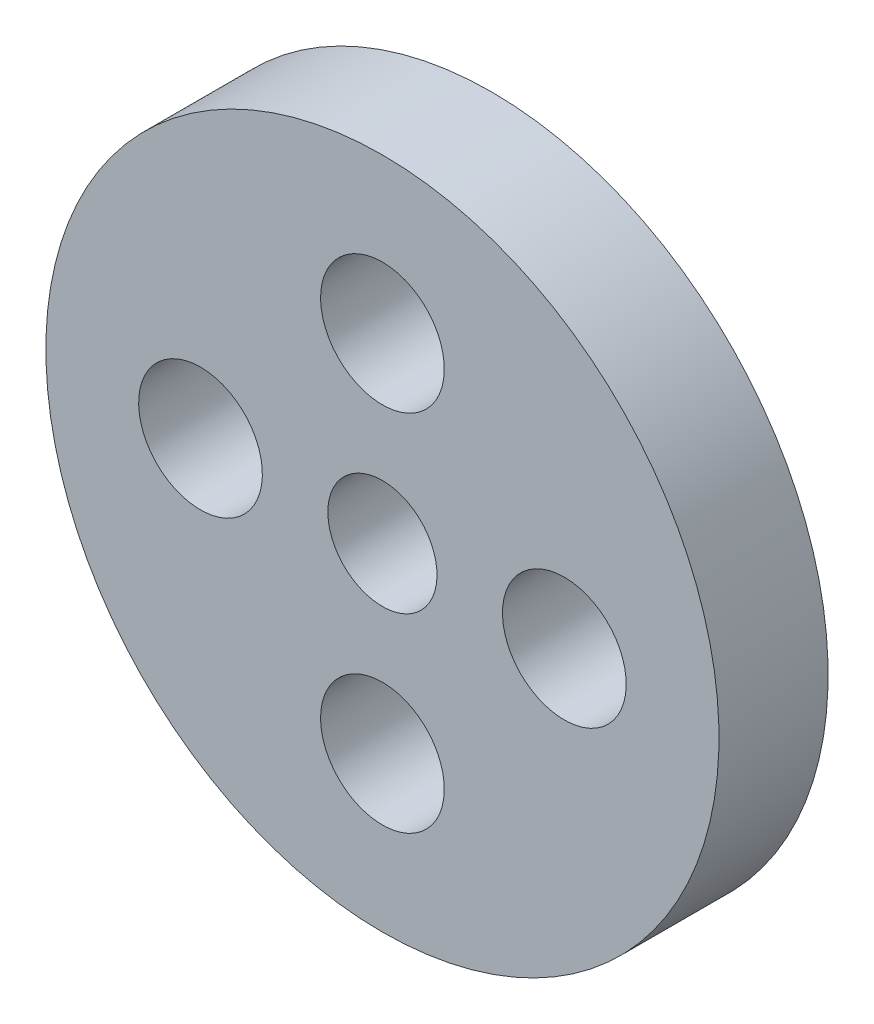
ISO-10303-21;
HEADER;
FILE_DESCRIPTION(('STEP AP214'),'2;1');
FILE_NAME('part.step','',(''),(''),'','','');
FILE_SCHEMA(('AUTOMOTIVE_DESIGN { 1 0 10303 214 1 1 1 1 }'));
ENDSEC;
DATA;
#1=APPLICATION_CONTEXT('core data for automotive mechanical design processes');
#2=APPLICATION_PROTOCOL_DEFINITION('international standard','automotive_design',2000,#1);
#3=PRODUCT_CONTEXT('',#1,'mechanical');
#4=PRODUCT('Part','Part','',(#3));
#5=PRODUCT_RELATED_PRODUCT_CATEGORY('part','',(#4));
#6=PRODUCT_DEFINITION_FORMATION('','',#4);
#7=PRODUCT_DEFINITION_CONTEXT('part definition',#1,'design');
#8=PRODUCT_DEFINITION('design','',#6,#7);
#9=PRODUCT_DEFINITION_SHAPE('','',#8);
#10=(LENGTH_UNIT() NAMED_UNIT(*) SI_UNIT(.MILLI.,.METRE.));
#11=(NAMED_UNIT(*) PLANE_ANGLE_UNIT() SI_UNIT($,.RADIAN.));
#12=(NAMED_UNIT(*) SI_UNIT($,.STERADIAN.) SOLID_ANGLE_UNIT());
#13=UNCERTAINTY_MEASURE_WITH_UNIT(LENGTH_MEASURE(1.E-05),#10,'distance_accuracy_value','');
#14=(GEOMETRIC_REPRESENTATION_CONTEXT(3) GLOBAL_UNCERTAINTY_ASSIGNED_CONTEXT((#13)) GLOBAL_UNIT_ASSIGNED_CONTEXT((#10,
#11,#12)) REPRESENTATION_CONTEXT('',''));
#15=CARTESIAN_POINT('',(0.,0.,0.));
#16=DIRECTION('',(0.,0.,1.));
#17=DIRECTION('',(1.,0.,0.));
#18=AXIS2_PLACEMENT_3D('',#15,#16,#17);
#19=CARTESIAN_POINT('',(0.,0.,86.2));
#20=DIRECTION('',(0.,0.,1.));
#21=DIRECTION('',(2.965E-12,1.,0.));
#22=AXIS2_PLACEMENT_3D('',#19,#20,#21);
#23=PLANE('',#22);
#24=CARTESIAN_POINT('',(0.,0.,86.2));
#25=DIRECTION('',(0.,0.,-1.));
#26=DIRECTION('',(-2.965E-12,-1.,0.));
#27=AXIS2_PLACEMENT_3D('',#24,#25,#26);
#28=CIRCLE('',#27,1.5);
#29=CARTESIAN_POINT('',(4.44731630298013E-12,1.5,86.2));
#30=VERTEX_POINT('',#29);
#31=EDGE_CURVE('E121',#30,#30,#28,.T.);
#32=ORIENTED_EDGE('',*,*,#31,.F.);
#33=EDGE_LOOP('',(#32));
#34=FACE_BOUND('',#33,.T.);
#35=CARTESIAN_POINT('',(5.,-1.48262246467991E-11,86.2));
#36=DIRECTION('',(0.,0.,-1.));
#37=DIRECTION('',(-2.965E-12,-1.,0.));
#38=AXIS2_PLACEMENT_3D('',#35,#36,#37);
#39=CIRCLE('',#38,1.7);
#40=CARTESIAN_POINT('',(5.00000000000504,1.69999999998517,86.2));
#41=VERTEX_POINT('',#40);
#42=EDGE_CURVE('E148',#41,#41,#39,.T.);
#43=ORIENTED_EDGE('',*,*,#42,.F.);
#44=EDGE_LOOP('',(#43));
#45=FACE_BOUND('',#44,.T.);
#46=CARTESIAN_POINT('',(1.48272204460493E-11,5.,86.2));
#47=DIRECTION('',(0.,0.,-1.));
#48=DIRECTION('',(-2.965E-12,-1.,0.));
#49=AXIS2_PLACEMENT_3D('',#46,#47,#48);
#50=CIRCLE('',#49,1.7);
#51=CARTESIAN_POINT('',(1.98675122560934E-11,6.7,86.2));
#52=VERTEX_POINT('',#51);
#53=EDGE_CURVE('E165',#52,#52,#50,.T.);
#54=ORIENTED_EDGE('',*,*,#53,.F.);
#55=EDGE_LOOP('',(#54));
#56=FACE_BOUND('',#55,.T.);
#57=CARTESIAN_POINT('',(-5.,1.4825E-11,86.2));
#58=DIRECTION('',(0.,0.,-1.));
#59=DIRECTION('',(-2.965E-12,-1.,0.));
#60=AXIS2_PLACEMENT_3D('',#57,#58,#59);
#61=CIRCLE('',#60,1.7);
#62=CARTESIAN_POINT('',(-4.99999999999496,1.70000000001482,86.2));
#63=VERTEX_POINT('',#62);
#64=EDGE_CURVE('E160',#63,#63,#61,.T.);
#65=ORIENTED_EDGE('',*,*,#64,.F.);
#66=EDGE_LOOP('',(#65));
#67=FACE_BOUND('',#66,.T.);
#68=CARTESIAN_POINT('',(-1.4825E-11,-5.,86.2));
#69=DIRECTION('',(0.,0.,-1.));
#70=DIRECTION('',(-2.965E-12,-1.,0.));
#71=AXIS2_PLACEMENT_3D('',#68,#69,#70);
#72=CIRCLE('',#71,1.7);
#73=CARTESIAN_POINT('',(-9.78470818995586E-12,-3.3,86.2));
#74=VERTEX_POINT('',#73);
#75=EDGE_CURVE('E134',#74,#74,#72,.T.);
#76=ORIENTED_EDGE('',*,*,#75,.F.);
#77=EDGE_LOOP('',(#76));
#78=FACE_BOUND('',#77,.T.);
#79=CARTESIAN_POINT('',(0.,0.,86.2));
#80=DIRECTION('',(0.,0.,1.));
#81=DIRECTION('',(2.965E-12,1.,0.));
#82=AXIS2_PLACEMENT_3D('',#79,#80,#81);
#83=CIRCLE('',#82,9.25);
#84=CARTESIAN_POINT('',(-2.74251172017108E-11,-9.25,86.2));
#85=VERTEX_POINT('',#84);
#86=EDGE_CURVE('E11',#85,#85,#83,.T.);
#87=ORIENTED_EDGE('',*,*,#86,.F.);
#88=EDGE_LOOP('',(#87));
#89=FACE_BOUND('',#88,.T.);
#90=ADVANCED_FACE('F49',(#34,#45,#56,#67,#78,#89),#23,.F.);
#91=CARTESIAN_POINT('',(0.,0.,89.2));
#92=DIRECTION('',(0.,0.,1.));
#93=DIRECTION('',(2.965E-12,1.,0.));
#94=AXIS2_PLACEMENT_3D('',#91,#92,#93);
#95=PLANE('',#94);
#96=CARTESIAN_POINT('',(0.,0.,89.2));
#97=DIRECTION('',(0.,0.,-1.));
#98=DIRECTION('',(-2.965E-12,-1.,0.));
#99=AXIS2_PLACEMENT_3D('',#96,#97,#98);
#100=CIRCLE('',#99,1.5);
#101=CARTESIAN_POINT('',(4.44731630298013E-12,1.5,89.2));
#102=VERTEX_POINT('',#101);
#103=EDGE_CURVE('E119',#102,#102,#100,.T.);
#104=ORIENTED_EDGE('',*,*,#103,.T.);
#105=EDGE_LOOP('',(#104));
#106=FACE_BOUND('',#105,.T.);
#107=CARTESIAN_POINT('',(5.,-1.48262246467991E-11,89.2));
#108=DIRECTION('',(0.,0.,-1.));
#109=DIRECTION('',(-2.965E-12,-1.,0.));
#110=AXIS2_PLACEMENT_3D('',#107,#108,#109);
#111=CIRCLE('',#110,1.7);
#112=CARTESIAN_POINT('',(5.00000000000504,1.69999999998517,89.2));
#113=VERTEX_POINT('',#112);
#114=EDGE_CURVE('E137',#113,#113,#111,.T.);
#115=ORIENTED_EDGE('',*,*,#114,.T.);
#116=EDGE_LOOP('',(#115));
#117=FACE_BOUND('',#116,.T.);
#118=CARTESIAN_POINT('',(1.48272204460493E-11,5.,89.2));
#119=DIRECTION('',(0.,0.,-1.));
#120=DIRECTION('',(-2.965E-12,-1.,0.));
#121=AXIS2_PLACEMENT_3D('',#118,#119,#120);
#122=CIRCLE('',#121,1.7);
#123=CARTESIAN_POINT('',(1.98675122560934E-11,6.7,89.2));
#124=VERTEX_POINT('',#123);
#125=EDGE_CURVE('E151',#124,#124,#122,.T.);
#126=ORIENTED_EDGE('',*,*,#125,.T.);
#127=EDGE_LOOP('',(#126));
#128=FACE_BOUND('',#127,.T.);
#129=CARTESIAN_POINT('',(-5.,1.4825E-11,89.2));
#130=DIRECTION('',(0.,0.,-1.));
#131=DIRECTION('',(-2.965E-12,-1.,0.));
#132=AXIS2_PLACEMENT_3D('',#129,#130,#131);
#133=CIRCLE('',#132,1.7);
#134=CARTESIAN_POINT('',(-4.99999999999496,1.70000000001482,89.2));
#135=VERTEX_POINT('',#134);
#136=EDGE_CURVE('E161',#135,#135,#133,.T.);
#137=ORIENTED_EDGE('',*,*,#136,.T.);
#138=EDGE_LOOP('',(#137));
#139=FACE_BOUND('',#138,.T.);
#140=CARTESIAN_POINT('',(-1.4825E-11,-5.,89.2));
#141=DIRECTION('',(0.,0.,-1.));
#142=DIRECTION('',(-2.965E-12,-1.,0.));
#143=AXIS2_PLACEMENT_3D('',#140,#141,#142);
#144=CIRCLE('',#143,1.7);
#145=CARTESIAN_POINT('',(-9.78470818995586E-12,-3.3,89.2));
#146=VERTEX_POINT('',#145);
#147=EDGE_CURVE('E166',#146,#146,#144,.T.);
#148=ORIENTED_EDGE('',*,*,#147,.T.);
#149=EDGE_LOOP('',(#148));
#150=FACE_BOUND('',#149,.T.);
#151=CARTESIAN_POINT('',(0.,0.,89.2));
#152=DIRECTION('',(0.,0.,1.));
#153=DIRECTION('',(2.965E-12,1.,0.));
#154=AXIS2_PLACEMENT_3D('',#151,#152,#153);
#155=CIRCLE('',#154,9.25);
#156=CARTESIAN_POINT('',(-2.74251172017108E-11,-9.25,89.2));
#157=VERTEX_POINT('',#156);
#158=EDGE_CURVE('E132',#157,#157,#155,.T.);
#159=ORIENTED_EDGE('',*,*,#158,.T.);
#160=EDGE_LOOP('',(#159));
#161=FACE_BOUND('',#160,.T.);
#162=ADVANCED_FACE('F125',(#106,#117,#128,#139,#150,#161),#95,.T.);
#163=CARTESIAN_POINT('',(0.,0.,86.2));
#164=DIRECTION('',(0.,0.,1.));
#165=DIRECTION('',(2.965E-12,1.,0.));
#166=AXIS2_PLACEMENT_3D('',#163,#164,#165);
#167=CYLINDRICAL_SURFACE('',#166,9.25);
#168=ORIENTED_EDGE('',*,*,#158,.F.);
#169=DIRECTION('',(0.,0.,-1.));
#170=VECTOR('',#169,1.);
#171=CARTESIAN_POINT('',(-2.74251172017108E-11,-9.25,86.2));
#172=LINE('',#171,#170);
#173=EDGE_CURVE('E52',#157,#85,#172,.T.);
#174=ORIENTED_EDGE('',*,*,#173,.T.);
#175=ORIENTED_EDGE('',*,*,#86,.T.);
#176=ORIENTED_EDGE('',*,*,#173,.F.);
#177=EDGE_LOOP('',(#168,#174,#175,#176));
#178=FACE_BOUND('',#177,.T.);
#179=ADVANCED_FACE('F187',(#178),#167,.T.);
#180=CARTESIAN_POINT('',(-1.4825E-11,-5.,86.2));
#181=DIRECTION('',(0.,0.,1.));
#182=DIRECTION('',(-2.965E-12,-1.,0.));
#183=AXIS2_PLACEMENT_3D('',#180,#181,#182);
#184=CYLINDRICAL_SURFACE('',#183,1.7);
#185=ORIENTED_EDGE('',*,*,#147,.F.);
#186=DIRECTION('',(0.,0.,-1.));
#187=VECTOR('',#186,1.);
#188=CARTESIAN_POINT('',(-9.78470818995586E-12,-3.3,86.2));
#189=LINE('',#188,#187);
#190=EDGE_CURVE('E140',#146,#74,#189,.T.);
#191=ORIENTED_EDGE('',*,*,#190,.T.);
#192=ORIENTED_EDGE('',*,*,#75,.T.);
#193=ORIENTED_EDGE('',*,*,#190,.F.);
#194=EDGE_LOOP('',(#185,#191,#192,#193));
#195=FACE_BOUND('',#194,.T.);
#196=ADVANCED_FACE('F182',(#195),#184,.F.);
#197=CARTESIAN_POINT('',(-5.,1.4825E-11,86.2));
#198=DIRECTION('',(0.,0.,1.));
#199=DIRECTION('',(-2.965E-12,-1.,0.));
#200=AXIS2_PLACEMENT_3D('',#197,#198,#199);
#201=CYLINDRICAL_SURFACE('',#200,1.7);
#202=ORIENTED_EDGE('',*,*,#136,.F.);
#203=DIRECTION('',(0.,0.,-1.));
#204=VECTOR('',#203,1.);
#205=CARTESIAN_POINT('',(-4.99999999999496,1.70000000001482,86.2));
#206=LINE('',#205,#204);
#207=EDGE_CURVE('E156',#135,#63,#206,.T.);
#208=ORIENTED_EDGE('',*,*,#207,.T.);
#209=ORIENTED_EDGE('',*,*,#64,.T.);
#210=ORIENTED_EDGE('',*,*,#207,.F.);
#211=EDGE_LOOP('',(#202,#208,#209,#210));
#212=FACE_BOUND('',#211,.T.);
#213=ADVANCED_FACE('F203',(#212),#201,.F.);
#214=CARTESIAN_POINT('',(1.48272204460493E-11,5.,86.2));
#215=DIRECTION('',(0.,0.,1.));
#216=DIRECTION('',(-2.965E-12,-1.,0.));
#217=AXIS2_PLACEMENT_3D('',#214,#215,#216);
#218=CYLINDRICAL_SURFACE('',#217,1.7);
#219=ORIENTED_EDGE('',*,*,#125,.F.);
#220=DIRECTION('',(0.,0.,-1.));
#221=VECTOR('',#220,1.);
#222=CARTESIAN_POINT('',(1.98675122560934E-11,6.7,86.2));
#223=LINE('',#222,#221);
#224=EDGE_CURVE('E155',#124,#52,#223,.T.);
#225=ORIENTED_EDGE('',*,*,#224,.T.);
#226=ORIENTED_EDGE('',*,*,#53,.T.);
#227=ORIENTED_EDGE('',*,*,#224,.F.);
#228=EDGE_LOOP('',(#219,#225,#226,#227));
#229=FACE_BOUND('',#228,.T.);
#230=ADVANCED_FACE('F211',(#229),#218,.F.);
#231=CARTESIAN_POINT('',(5.,-1.48262246467991E-11,86.2));
#232=DIRECTION('',(0.,0.,1.));
#233=DIRECTION('',(-2.965E-12,-1.,0.));
#234=AXIS2_PLACEMENT_3D('',#231,#232,#233);
#235=CYLINDRICAL_SURFACE('',#234,1.7);
#236=ORIENTED_EDGE('',*,*,#114,.F.);
#237=DIRECTION('',(0.,0.,-1.));
#238=VECTOR('',#237,1.);
#239=CARTESIAN_POINT('',(5.00000000000504,1.69999999998517,86.2));
#240=LINE('',#239,#238);
#241=EDGE_CURVE('E144',#113,#41,#240,.T.);
#242=ORIENTED_EDGE('',*,*,#241,.T.);
#243=ORIENTED_EDGE('',*,*,#42,.T.);
#244=ORIENTED_EDGE('',*,*,#241,.F.);
#245=EDGE_LOOP('',(#236,#242,#243,#244));
#246=FACE_BOUND('',#245,.T.);
#247=ADVANCED_FACE('F194',(#246),#235,.F.);
#248=CARTESIAN_POINT('',(0.,0.,86.2));
#249=DIRECTION('',(0.,0.,1.));
#250=DIRECTION('',(-2.965E-12,-1.,0.));
#251=AXIS2_PLACEMENT_3D('',#248,#249,#250);
#252=CYLINDRICAL_SURFACE('',#251,1.5);
#253=ORIENTED_EDGE('',*,*,#103,.F.);
#254=DIRECTION('',(0.,0.,-1.));
#255=VECTOR('',#254,1.);
#256=CARTESIAN_POINT('',(4.44731630298013E-12,1.5,86.2));
#257=LINE('',#256,#255);
#258=EDGE_CURVE('E116',#102,#30,#257,.T.);
#259=ORIENTED_EDGE('',*,*,#258,.T.);
#260=ORIENTED_EDGE('',*,*,#31,.T.);
#261=ORIENTED_EDGE('',*,*,#258,.F.);
#262=EDGE_LOOP('',(#253,#259,#260,#261));
#263=FACE_BOUND('',#262,.T.);
#264=ADVANCED_FACE('F118',(#263),#252,.F.);
#265=CLOSED_SHELL('',(#90,#162,#179,#196,#213,#230,#247,#264));
#266=MANIFOLD_SOLID_BREP('B2',#265);
#267=ADVANCED_BREP_SHAPE_REPRESENTATION('',(#18,#266),#14);
#268=SHAPE_DEFINITION_REPRESENTATION(#9,#267);
ENDSEC;
END-ISO-10303-21;
